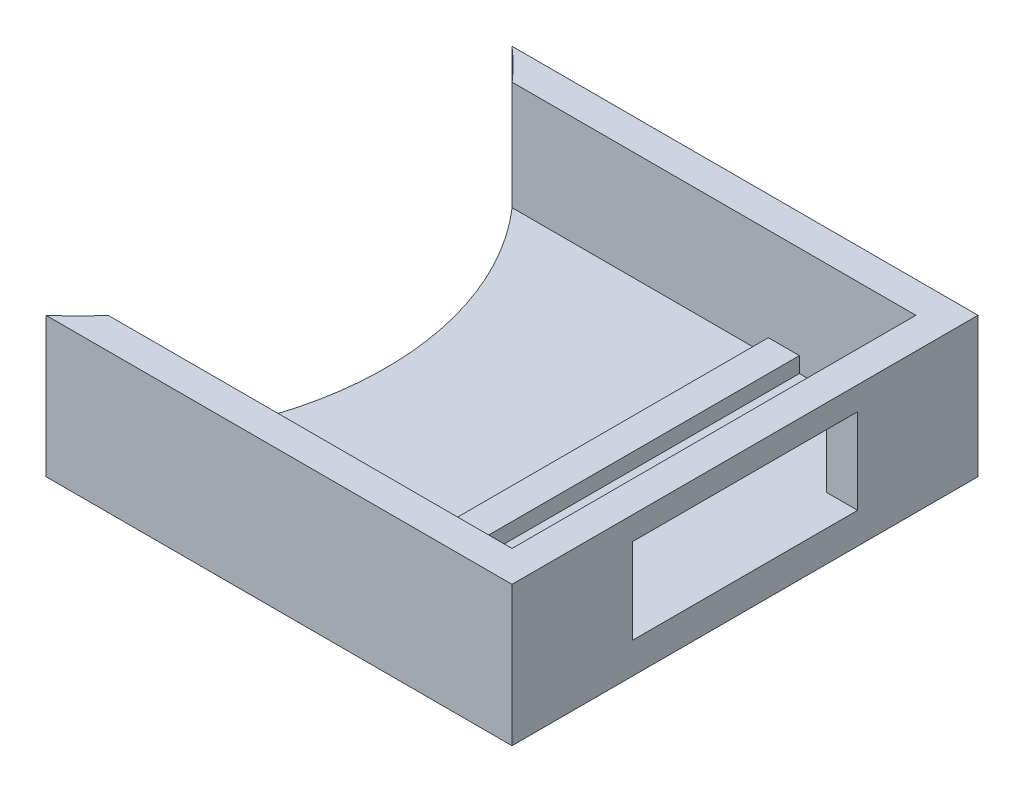
ISO-10303-21;
HEADER;
FILE_DESCRIPTION(('STEP AP214'),'2;1');
FILE_NAME('part.step','',(''),(''),'','','');
FILE_SCHEMA(('AUTOMOTIVE_DESIGN { 1 0 10303 214 1 1 1 1 }'));
ENDSEC;
DATA;
#1=APPLICATION_CONTEXT('core data for automotive mechanical design processes');
#2=APPLICATION_PROTOCOL_DEFINITION('international standard','automotive_design',2000,#1);
#3=PRODUCT_CONTEXT('',#1,'mechanical');
#4=PRODUCT('Part','Part','',(#3));
#5=PRODUCT_RELATED_PRODUCT_CATEGORY('part','',(#4));
#6=PRODUCT_DEFINITION_FORMATION('','',#4);
#7=PRODUCT_DEFINITION_CONTEXT('part definition',#1,'design');
#8=PRODUCT_DEFINITION('design','',#6,#7);
#9=PRODUCT_DEFINITION_SHAPE('','',#8);
#10=(LENGTH_UNIT() NAMED_UNIT(*) SI_UNIT(.MILLI.,.METRE.));
#11=(NAMED_UNIT(*) PLANE_ANGLE_UNIT() SI_UNIT($,.RADIAN.));
#12=(NAMED_UNIT(*) SI_UNIT($,.STERADIAN.) SOLID_ANGLE_UNIT());
#13=UNCERTAINTY_MEASURE_WITH_UNIT(LENGTH_MEASURE(1.E-05),#10,'distance_accuracy_value','');
#14=(GEOMETRIC_REPRESENTATION_CONTEXT(3) GLOBAL_UNCERTAINTY_ASSIGNED_CONTEXT((#13)) GLOBAL_UNIT_ASSIGNED_CONTEXT((#10,
#11,#12)) REPRESENTATION_CONTEXT('',''));
#15=CARTESIAN_POINT('',(0.,0.,0.));
#16=DIRECTION('',(0.,0.,1.));
#17=DIRECTION('',(1.,0.,0.));
#18=AXIS2_PLACEMENT_3D('',#15,#16,#17);
#19=CARTESIAN_POINT('',(0.,2.,0.));
#20=DIRECTION('',(0.,1.,0.));
#21=DIRECTION('',(0.,0.,1.));
#22=AXIS2_PLACEMENT_3D('',#19,#20,#21);
#23=PLANE('',#22);
#24=DIRECTION('',(-1.,0.,0.));
#25=VECTOR('',#24,1.);
#26=CARTESIAN_POINT('',(0.,2.,9.05326953750821));
#27=LINE('',#26,#25);
#28=CARTESIAN_POINT('',(2.57839758301479,2.,9.05326953750821));
#29=VERTEX_POINT('',#28);
#30=CARTESIAN_POINT('',(-13.9114741920324,2.,9.05326953750822));
#31=VERTEX_POINT('',#30);
#32=EDGE_CURVE('E276',#29,#31,#27,.T.);
#33=ORIENTED_EDGE('',*,*,#32,.F.);
#34=DIRECTION('',(0.,0.,1.));
#35=VECTOR('',#34,1.);
#36=CARTESIAN_POINT('',(2.57839758301478,2.,-16.9467304624918));
#37=LINE('',#36,#35);
#38=CARTESIAN_POINT('',(2.57839758301478,2.,-16.9467304624918));
#39=VERTEX_POINT('',#38);
#40=EDGE_CURVE('E174',#39,#29,#37,.T.);
#41=ORIENTED_EDGE('',*,*,#40,.F.);
#42=DIRECTION('',(1.,0.,0.));
#43=VECTOR('',#42,1.);
#44=CARTESIAN_POINT('',(0.,2.,-16.9467304624918));
#45=LINE('',#44,#43);
#46=CARTESIAN_POINT('',(-13.9114741920324,2.,-16.9467304624918));
#47=VERTEX_POINT('',#46);
#48=EDGE_CURVE('E249',#47,#39,#45,.T.);
#49=ORIENTED_EDGE('',*,*,#48,.F.);
#50=CARTESIAN_POINT('',(-28.845997954108,2.,-3.94673046249178));
#51=DIRECTION('',(0.,1.,0.));
#52=DIRECTION('',(0.,0.,1.));
#53=AXIS2_PLACEMENT_3D('',#50,#51,#52);
#54=CIRCLE('',#53,19.8);
#55=EDGE_CURVE('E300',#31,#47,#54,.T.);
#56=ORIENTED_EDGE('',*,*,#55,.F.);
#57=EDGE_LOOP('',(#33,#41,#49,#56));
#58=FACE_BOUND('',#57,.T.);
#59=ADVANCED_FACE('F45',(#58),#23,.T.);
#60=CARTESIAN_POINT('',(4.57839758301478,2.,-16.9467304624918));
#61=VERTEX_POINT('',#60);
#62=CARTESIAN_POINT('',(12.0783975830148,2.,-16.9467304624918));
#63=VERTEX_POINT('',#62);
#64=EDGE_CURVE('E280',#61,#63,#45,.T.);
#65=ORIENTED_EDGE('',*,*,#64,.F.);
#66=DIRECTION('',(0.,0.,-1.));
#67=VECTOR('',#66,1.);
#68=CARTESIAN_POINT('',(4.57839758301478,2.,-16.9467304624918));
#69=LINE('',#68,#67);
#70=CARTESIAN_POINT('',(4.57839758301479,2.,9.05326953750821));
#71=VERTEX_POINT('',#70);
#72=EDGE_CURVE('E168',#71,#61,#69,.T.);
#73=ORIENTED_EDGE('',*,*,#72,.F.);
#74=CARTESIAN_POINT('',(12.0783975830148,2.,9.05326953750821));
#75=VERTEX_POINT('',#74);
#76=EDGE_CURVE('E277',#75,#71,#27,.T.);
#77=ORIENTED_EDGE('',*,*,#76,.F.);
#78=DIRECTION('',(0.,0.,1.));
#79=VECTOR('',#78,1.);
#80=CARTESIAN_POINT('',(12.0783975830148,2.,0.));
#81=LINE('',#80,#79);
#82=CARTESIAN_POINT('',(12.0783975830148,2.,3.30326953750822));
#83=VERTEX_POINT('',#82);
#84=EDGE_CURVE('E234',#83,#75,#81,.T.);
#85=ORIENTED_EDGE('',*,*,#84,.F.);
#86=DIRECTION('',(-1.,0.,0.));
#87=VECTOR('',#86,1.);
#88=CARTESIAN_POINT('',(14.0783975830148,2.,3.30326953750822));
#89=LINE('',#88,#87);
#90=CARTESIAN_POINT('',(14.0783975830148,2.,3.30326953750822));
#91=VERTEX_POINT('',#90);
#92=EDGE_CURVE('E238',#91,#83,#89,.T.);
#93=ORIENTED_EDGE('',*,*,#92,.F.);
#94=DIRECTION('',(0.,0.,1.));
#95=VECTOR('',#94,1.);
#96=CARTESIAN_POINT('',(14.0783975830148,2.,-11.1967304624918));
#97=LINE('',#96,#95);
#98=CARTESIAN_POINT('',(14.0783975830148,2.,-11.1967304624918));
#99=VERTEX_POINT('',#98);
#100=EDGE_CURVE('E210',#99,#91,#97,.T.);
#101=ORIENTED_EDGE('',*,*,#100,.F.);
#102=DIRECTION('',(-1.,0.,0.));
#103=VECTOR('',#102,1.);
#104=CARTESIAN_POINT('',(14.0783975830148,2.,-11.1967304624918));
#105=LINE('',#104,#103);
#106=CARTESIAN_POINT('',(12.0783975830148,2.,-11.1967304624918));
#107=VERTEX_POINT('',#106);
#108=EDGE_CURVE('E221',#99,#107,#105,.T.);
#109=ORIENTED_EDGE('',*,*,#108,.T.);
#110=EDGE_CURVE('E273',#63,#107,#81,.T.);
#111=ORIENTED_EDGE('',*,*,#110,.F.);
#112=EDGE_LOOP('',(#65,#73,#77,#85,#93,#101,#109,#111));
#113=FACE_BOUND('',#112,.T.);
#114=ADVANCED_FACE('F406',(#113),#23,.T.);
#115=CARTESIAN_POINT('',(0.,9.,9.05326953750821));
#116=DIRECTION('',(0.,0.,1.));
#117=DIRECTION('',(1.,0.,0.));
#118=AXIS2_PLACEMENT_3D('',#115,#116,#117);
#119=PLANE('',#118);
#120=DIRECTION('',(0.,-1.,0.));
#121=VECTOR('',#120,1.);
#122=CARTESIAN_POINT('',(2.57839758301479,3.,9.05326953750821));
#123=LINE('',#122,#121);
#124=CARTESIAN_POINT('',(2.57839758301479,3.,9.05326953750821));
#125=VERTEX_POINT('',#124);
#126=EDGE_CURVE('E171',#125,#29,#123,.T.);
#127=ORIENTED_EDGE('',*,*,#126,.T.);
#128=ORIENTED_EDGE('',*,*,#32,.T.);
#129=DIRECTION('',(0.,-1.,0.));
#130=VECTOR('',#129,1.);
#131=CARTESIAN_POINT('',(-13.9114741920324,9.,9.05326953750822));
#132=LINE('',#131,#130);
#133=CARTESIAN_POINT('',(-13.9114741920324,9.,9.05326953750822));
#134=VERTEX_POINT('',#133);
#135=EDGE_CURVE('E291',#134,#31,#132,.T.);
#136=ORIENTED_EDGE('',*,*,#135,.F.);
#137=DIRECTION('',(-1.,0.,0.));
#138=VECTOR('',#137,1.);
#139=CARTESIAN_POINT('',(0.,9.,9.05326953750821));
#140=LINE('',#139,#138);
#141=CARTESIAN_POINT('',(12.0783975830148,9.,9.05326953750821));
#142=VERTEX_POINT('',#141);
#143=EDGE_CURVE('E248',#142,#134,#140,.T.);
#144=ORIENTED_EDGE('',*,*,#143,.F.);
#145=DIRECTION('',(0.,-1.,0.));
#146=VECTOR('',#145,1.);
#147=CARTESIAN_POINT('',(12.0783975830148,9.,9.05326953750821));
#148=LINE('',#147,#146);
#149=EDGE_CURVE('E295',#142,#75,#148,.T.);
#150=ORIENTED_EDGE('',*,*,#149,.T.);
#151=ORIENTED_EDGE('',*,*,#76,.T.);
#152=DIRECTION('',(0.,-1.,0.));
#153=VECTOR('',#152,1.);
#154=CARTESIAN_POINT('',(4.57839758301479,3.,9.05326953750821));
#155=LINE('',#154,#153);
#156=CARTESIAN_POINT('',(4.57839758301479,3.,9.05326953750821));
#157=VERTEX_POINT('',#156);
#158=EDGE_CURVE('E179',#157,#71,#155,.T.);
#159=ORIENTED_EDGE('',*,*,#158,.F.);
#160=DIRECTION('',(1.,0.,0.));
#161=VECTOR('',#160,1.);
#162=CARTESIAN_POINT('',(2.57839758301479,3.,9.05326953750821));
#163=LINE('',#162,#161);
#164=EDGE_CURVE('E162',#125,#157,#163,.T.);
#165=ORIENTED_EDGE('',*,*,#164,.F.);
#166=EDGE_LOOP('',(#127,#128,#136,#144,#150,#151,#159,#165));
#167=FACE_BOUND('',#166,.T.);
#168=ADVANCED_FACE('F182',(#167),#119,.F.);
#169=CARTESIAN_POINT('',(0.,9.,-16.9467304624918));
#170=DIRECTION('',(0.,0.,-1.));
#171=DIRECTION('',(-1.,0.,0.));
#172=AXIS2_PLACEMENT_3D('',#169,#170,#171);
#173=PLANE('',#172);
#174=DIRECTION('',(0.,-1.,0.));
#175=VECTOR('',#174,1.);
#176=CARTESIAN_POINT('',(2.57839758301478,3.,-16.9467304624918));
#177=LINE('',#176,#175);
#178=CARTESIAN_POINT('',(2.57839758301478,3.,-16.9467304624918));
#179=VERTEX_POINT('',#178);
#180=EDGE_CURVE('E195',#179,#39,#177,.T.);
#181=ORIENTED_EDGE('',*,*,#180,.F.);
#182=DIRECTION('',(-1.,0.,0.));
#183=VECTOR('',#182,1.);
#184=CARTESIAN_POINT('',(2.57839758301478,3.,-16.9467304624918));
#185=LINE('',#184,#183);
#186=CARTESIAN_POINT('',(4.57839758301479,3.,-16.9467304624918));
#187=VERTEX_POINT('',#186);
#188=EDGE_CURVE('E164',#187,#179,#185,.T.);
#189=ORIENTED_EDGE('',*,*,#188,.F.);
#190=DIRECTION('',(0.,-1.,0.));
#191=VECTOR('',#190,1.);
#192=CARTESIAN_POINT('',(4.57839758301478,3.,-16.9467304624918));
#193=LINE('',#192,#191);
#194=EDGE_CURVE('E61',#187,#61,#193,.T.);
#195=ORIENTED_EDGE('',*,*,#194,.T.);
#196=ORIENTED_EDGE('',*,*,#64,.T.);
#197=DIRECTION('',(0.,-1.,0.));
#198=VECTOR('',#197,1.);
#199=CARTESIAN_POINT('',(12.0783975830148,9.,-16.9467304624918));
#200=LINE('',#199,#198);
#201=CARTESIAN_POINT('',(12.0783975830148,9.,-16.9467304624918));
#202=VERTEX_POINT('',#201);
#203=EDGE_CURVE('E272',#202,#63,#200,.T.);
#204=ORIENTED_EDGE('',*,*,#203,.F.);
#205=DIRECTION('',(1.,0.,0.));
#206=VECTOR('',#205,1.);
#207=CARTESIAN_POINT('',(0.,9.,-16.9467304624918));
#208=LINE('',#207,#206);
#209=CARTESIAN_POINT('',(-13.9114741920324,9.,-16.9467304624918));
#210=VERTEX_POINT('',#209);
#211=EDGE_CURVE('E269',#210,#202,#208,.T.);
#212=ORIENTED_EDGE('',*,*,#211,.F.);
#213=DIRECTION('',(0.,-1.,0.));
#214=VECTOR('',#213,1.);
#215=CARTESIAN_POINT('',(-13.9114741920324,9.,-16.9467304624918));
#216=LINE('',#215,#214);
#217=EDGE_CURVE('E287',#210,#47,#216,.T.);
#218=ORIENTED_EDGE('',*,*,#217,.T.);
#219=ORIENTED_EDGE('',*,*,#48,.T.);
#220=EDGE_LOOP('',(#181,#189,#195,#196,#204,#212,#218,#219));
#221=FACE_BOUND('',#220,.T.);
#222=ADVANCED_FACE('F402',(#221),#173,.F.);
#223=CARTESIAN_POINT('',(-28.845997954108,2.,-3.94673046249178));
#224=DIRECTION('',(0.,-1.,0.));
#225=DIRECTION('',(0.,0.,-1.));
#226=AXIS2_PLACEMENT_3D('',#223,#224,#225);
#227=CYLINDRICAL_SURFACE('',#226,19.8);
#228=CARTESIAN_POINT('',(-28.845997954108,0.,-3.94673046249178));
#229=DIRECTION('',(0.,1.,0.));
#230=DIRECTION('',(0.,0.,1.));
#231=AXIS2_PLACEMENT_3D('',#228,#229,#230);
#232=CIRCLE('',#231,19.8);
#233=CARTESIAN_POINT('',(-15.9216024169852,0.,11.0532695375082));
#234=VERTEX_POINT('',#233);
#235=CARTESIAN_POINT('',(-15.9216024169852,0.,-18.9467304624918));
#236=VERTEX_POINT('',#235);
#237=EDGE_CURVE('E299',#234,#236,#232,.T.);
#238=ORIENTED_EDGE('',*,*,#237,.F.);
#239=DIRECTION('',(0.,-1.,0.));
#240=VECTOR('',#239,1.);
#241=CARTESIAN_POINT('',(-15.9216024169852,2.,11.0532695375082));
#242=LINE('',#241,#240);
#243=CARTESIAN_POINT('',(-15.9216024169852,9.,11.0532695375082));
#244=VERTEX_POINT('',#243);
#245=EDGE_CURVE('E11',#244,#234,#242,.T.);
#246=ORIENTED_EDGE('',*,*,#245,.F.);
#247=CARTESIAN_POINT('',(-28.845997954108,9.,-3.94673046249178));
#248=DIRECTION('',(0.,1.,0.));
#249=DIRECTION('',(0.,0.,1.));
#250=AXIS2_PLACEMENT_3D('',#247,#248,#249);
#251=CIRCLE('',#250,19.8);
#252=EDGE_CURVE('E252',#134,#244,#251,.F.);
#253=ORIENTED_EDGE('',*,*,#252,.F.);
#254=ORIENTED_EDGE('',*,*,#135,.T.);
#255=ORIENTED_EDGE('',*,*,#55,.T.);
#256=ORIENTED_EDGE('',*,*,#217,.F.);
#257=CARTESIAN_POINT('',(-15.9216024169852,9.,-18.9467304624918));
#258=VERTEX_POINT('',#257);
#259=EDGE_CURVE('E257',#258,#210,#251,.F.);
#260=ORIENTED_EDGE('',*,*,#259,.F.);
#261=DIRECTION('',(0.,-1.,0.));
#262=VECTOR('',#261,1.);
#263=CARTESIAN_POINT('',(-15.9216024169852,2.,-18.9467304624918));
#264=LINE('',#263,#262);
#265=EDGE_CURVE('E304',#258,#236,#264,.T.);
#266=ORIENTED_EDGE('',*,*,#265,.T.);
#267=EDGE_LOOP('',(#238,#246,#253,#254,#255,#256,#260,#266));
#268=FACE_BOUND('',#267,.T.);
#269=ADVANCED_FACE('F47',(#268),#227,.F.);
#270=CARTESIAN_POINT('',(0.,2.,11.0532695375082));
#271=DIRECTION('',(0.,0.,1.));
#272=DIRECTION('',(1.,0.,0.));
#273=AXIS2_PLACEMENT_3D('',#270,#271,#272);
#274=PLANE('',#273);
#275=DIRECTION('',(-1.,0.,0.));
#276=VECTOR('',#275,1.);
#277=CARTESIAN_POINT('',(0.,0.,11.0532695375082));
#278=LINE('',#277,#276);
#279=CARTESIAN_POINT('',(14.0783975830148,0.,11.0532695375082));
#280=VERTEX_POINT('',#279);
#281=EDGE_CURVE('E309',#280,#234,#278,.T.);
#282=ORIENTED_EDGE('',*,*,#281,.F.);
#283=DIRECTION('',(0.,-1.,0.));
#284=VECTOR('',#283,1.);
#285=CARTESIAN_POINT('',(14.0783975830148,2.,11.0532695375082));
#286=LINE('',#285,#284);
#287=CARTESIAN_POINT('',(14.0783975830148,9.,11.0532695375082));
#288=VERTEX_POINT('',#287);
#289=EDGE_CURVE('E54',#288,#280,#286,.T.);
#290=ORIENTED_EDGE('',*,*,#289,.F.);
#291=DIRECTION('',(1.,0.,0.));
#292=VECTOR('',#291,1.);
#293=CARTESIAN_POINT('',(0.,9.,11.0532695375082));
#294=LINE('',#293,#292);
#295=EDGE_CURVE('E256',#244,#288,#294,.T.);
#296=ORIENTED_EDGE('',*,*,#295,.F.);
#297=ORIENTED_EDGE('',*,*,#245,.T.);
#298=EDGE_LOOP('',(#282,#290,#296,#297));
#299=FACE_BOUND('',#298,.T.);
#300=ADVANCED_FACE('F334',(#299),#274,.T.);
#301=CARTESIAN_POINT('',(14.0783975830148,2.,0.));
#302=DIRECTION('',(1.,0.,0.));
#303=DIRECTION('',(0.,0.,-1.));
#304=AXIS2_PLACEMENT_3D('',#301,#302,#303);
#305=PLANE('',#304);
#306=DIRECTION('',(0.,-1.,0.));
#307=VECTOR('',#306,1.);
#308=CARTESIAN_POINT('',(14.0783975830148,2.,-11.1967304624918));
#309=LINE('',#308,#307);
#310=CARTESIAN_POINT('',(14.0783975830148,7.5,-11.1967304624918));
#311=VERTEX_POINT('',#310);
#312=EDGE_CURVE('E206',#311,#99,#309,.T.);
#313=ORIENTED_EDGE('',*,*,#312,.T.);
#314=ORIENTED_EDGE('',*,*,#100,.T.);
#315=DIRECTION('',(0.,1.,0.));
#316=VECTOR('',#315,1.);
#317=CARTESIAN_POINT('',(14.0783975830148,2.,3.30326953750822));
#318=LINE('',#317,#316);
#319=CARTESIAN_POINT('',(14.0783975830148,7.5,3.30326953750821));
#320=VERTEX_POINT('',#319);
#321=EDGE_CURVE('E69',#91,#320,#318,.T.);
#322=ORIENTED_EDGE('',*,*,#321,.T.);
#323=DIRECTION('',(0.,0.,-1.));
#324=VECTOR('',#323,1.);
#325=CARTESIAN_POINT('',(14.0783975830148,7.5,-11.1967304624918));
#326=LINE('',#325,#324);
#327=EDGE_CURVE('E217',#320,#311,#326,.T.);
#328=ORIENTED_EDGE('',*,*,#327,.T.);
#329=EDGE_LOOP('',(#313,#314,#322,#328));
#330=FACE_BOUND('',#329,.T.);
#331=DIRECTION('',(0.,0.,1.));
#332=VECTOR('',#331,1.);
#333=CARTESIAN_POINT('',(14.0783975830148,0.,0.));
#334=LINE('',#333,#332);
#335=CARTESIAN_POINT('',(14.0783975830148,0.,-18.9467304624918));
#336=VERTEX_POINT('',#335);
#337=EDGE_CURVE('E313',#336,#280,#334,.T.);
#338=ORIENTED_EDGE('',*,*,#337,.F.);
#339=DIRECTION('',(0.,-1.,0.));
#340=VECTOR('',#339,1.);
#341=CARTESIAN_POINT('',(14.0783975830148,2.,-18.9467304624918));
#342=LINE('',#341,#340);
#343=CARTESIAN_POINT('',(14.0783975830148,9.,-18.9467304624918));
#344=VERTEX_POINT('',#343);
#345=EDGE_CURVE('E322',#344,#336,#342,.T.);
#346=ORIENTED_EDGE('',*,*,#345,.F.);
#347=DIRECTION('',(0.,0.,-1.));
#348=VECTOR('',#347,1.);
#349=CARTESIAN_POINT('',(14.0783975830148,9.,0.));
#350=LINE('',#349,#348);
#351=EDGE_CURVE('E261',#288,#344,#350,.T.);
#352=ORIENTED_EDGE('',*,*,#351,.F.);
#353=ORIENTED_EDGE('',*,*,#289,.T.);
#354=EDGE_LOOP('',(#338,#346,#352,#353));
#355=FACE_BOUND('',#354,.T.);
#356=ADVANCED_FACE('F331',(#330,#355),#305,.T.);
#357=CARTESIAN_POINT('',(0.,2.,-18.9467304624918));
#358=DIRECTION('',(0.,0.,-1.));
#359=DIRECTION('',(-1.,0.,0.));
#360=AXIS2_PLACEMENT_3D('',#357,#358,#359);
#361=PLANE('',#360);
#362=DIRECTION('',(1.,0.,0.));
#363=VECTOR('',#362,1.);
#364=CARTESIAN_POINT('',(0.,0.,-18.9467304624918));
#365=LINE('',#364,#363);
#366=EDGE_CURVE('E305',#236,#336,#365,.T.);
#367=ORIENTED_EDGE('',*,*,#366,.F.);
#368=ORIENTED_EDGE('',*,*,#265,.F.);
#369=DIRECTION('',(-1.,0.,0.));
#370=VECTOR('',#369,1.);
#371=CARTESIAN_POINT('',(0.,9.,-18.9467304624918));
#372=LINE('',#371,#370);
#373=EDGE_CURVE('E265',#344,#258,#372,.T.);
#374=ORIENTED_EDGE('',*,*,#373,.F.);
#375=ORIENTED_EDGE('',*,*,#345,.T.);
#376=EDGE_LOOP('',(#367,#368,#374,#375));
#377=FACE_BOUND('',#376,.T.);
#378=ADVANCED_FACE('F340',(#377),#361,.T.);
#379=CARTESIAN_POINT('',(0.,0.,0.));
#380=DIRECTION('',(0.,1.,0.));
#381=DIRECTION('',(0.,0.,1.));
#382=AXIS2_PLACEMENT_3D('',#379,#380,#381);
#383=PLANE('',#382);
#384=ORIENTED_EDGE('',*,*,#237,.T.);
#385=ORIENTED_EDGE('',*,*,#366,.T.);
#386=ORIENTED_EDGE('',*,*,#337,.T.);
#387=ORIENTED_EDGE('',*,*,#281,.T.);
#388=EDGE_LOOP('',(#384,#385,#386,#387));
#389=FACE_BOUND('',#388,.T.);
#390=ADVANCED_FACE('F337',(#389),#383,.F.);
#391=CARTESIAN_POINT('',(12.0783975830148,9.,0.));
#392=DIRECTION('',(1.,0.,0.));
#393=DIRECTION('',(0.,0.,-1.));
#394=AXIS2_PLACEMENT_3D('',#391,#392,#393);
#395=PLANE('',#394);
#396=ORIENTED_EDGE('',*,*,#110,.T.);
#397=DIRECTION('',(0.,-1.,0.));
#398=VECTOR('',#397,1.);
#399=CARTESIAN_POINT('',(12.0783975830148,2.,-11.1967304624918));
#400=LINE('',#399,#398);
#401=CARTESIAN_POINT('',(12.0783975830148,7.5,-11.1967304624918));
#402=VERTEX_POINT('',#401);
#403=EDGE_CURVE('E178',#402,#107,#400,.T.);
#404=ORIENTED_EDGE('',*,*,#403,.F.);
#405=DIRECTION('',(0.,0.,-1.));
#406=VECTOR('',#405,1.);
#407=CARTESIAN_POINT('',(12.0783975830148,7.5,-11.1967304624918));
#408=LINE('',#407,#406);
#409=CARTESIAN_POINT('',(12.0783975830148,7.5,3.30326953750822));
#410=VERTEX_POINT('',#409);
#411=EDGE_CURVE('E211',#410,#402,#408,.T.);
#412=ORIENTED_EDGE('',*,*,#411,.F.);
#413=DIRECTION('',(0.,1.,0.));
#414=VECTOR('',#413,1.);
#415=CARTESIAN_POINT('',(12.0783975830148,2.,3.30326953750822));
#416=LINE('',#415,#414);
#417=EDGE_CURVE('E224',#83,#410,#416,.T.);
#418=ORIENTED_EDGE('',*,*,#417,.F.);
#419=ORIENTED_EDGE('',*,*,#84,.T.);
#420=ORIENTED_EDGE('',*,*,#149,.F.);
#421=DIRECTION('',(0.,0.,1.));
#422=VECTOR('',#421,1.);
#423=CARTESIAN_POINT('',(12.0783975830148,9.,0.));
#424=LINE('',#423,#422);
#425=EDGE_CURVE('E244',#202,#142,#424,.T.);
#426=ORIENTED_EDGE('',*,*,#425,.F.);
#427=ORIENTED_EDGE('',*,*,#203,.T.);
#428=EDGE_LOOP('',(#396,#404,#412,#418,#419,#420,#426,#427));
#429=FACE_BOUND('',#428,.T.);
#430=ADVANCED_FACE('F410',(#429),#395,.F.);
#431=CARTESIAN_POINT('',(0.,9.,0.));
#432=DIRECTION('',(0.,1.,0.));
#433=DIRECTION('',(0.,0.,1.));
#434=AXIS2_PLACEMENT_3D('',#431,#432,#433);
#435=PLANE('',#434);
#436=ORIENTED_EDGE('',*,*,#425,.T.);
#437=ORIENTED_EDGE('',*,*,#143,.T.);
#438=ORIENTED_EDGE('',*,*,#252,.T.);
#439=ORIENTED_EDGE('',*,*,#295,.T.);
#440=ORIENTED_EDGE('',*,*,#351,.T.);
#441=ORIENTED_EDGE('',*,*,#373,.T.);
#442=ORIENTED_EDGE('',*,*,#259,.T.);
#443=ORIENTED_EDGE('',*,*,#211,.T.);
#444=EDGE_LOOP('',(#436,#437,#438,#439,#440,#441,#442,#443));
#445=FACE_BOUND('',#444,.T.);
#446=ADVANCED_FACE('F343',(#445),#435,.T.);
#447=CARTESIAN_POINT('',(14.0783975830148,2.,-11.1967304624918));
#448=DIRECTION('',(0.,0.,-1.));
#449=DIRECTION('',(-1.,0.,0.));
#450=AXIS2_PLACEMENT_3D('',#447,#448,#449);
#451=PLANE('',#450);
#452=ORIENTED_EDGE('',*,*,#403,.T.);
#453=ORIENTED_EDGE('',*,*,#108,.F.);
#454=ORIENTED_EDGE('',*,*,#312,.F.);
#455=DIRECTION('',(-1.,0.,0.));
#456=VECTOR('',#455,1.);
#457=CARTESIAN_POINT('',(14.0783975830148,7.5,-11.1967304624918));
#458=LINE('',#457,#456);
#459=EDGE_CURVE('E231',#311,#402,#458,.T.);
#460=ORIENTED_EDGE('',*,*,#459,.T.);
#461=EDGE_LOOP('',(#452,#453,#454,#460));
#462=FACE_BOUND('',#461,.T.);
#463=ADVANCED_FACE('F454',(#462),#451,.F.);
#464=CARTESIAN_POINT('',(14.0783975830148,7.5,-11.1967304624918));
#465=DIRECTION('',(0.,1.,0.));
#466=DIRECTION('',(0.,0.,1.));
#467=AXIS2_PLACEMENT_3D('',#464,#465,#466);
#468=PLANE('',#467);
#469=ORIENTED_EDGE('',*,*,#411,.T.);
#470=ORIENTED_EDGE('',*,*,#459,.F.);
#471=ORIENTED_EDGE('',*,*,#327,.F.);
#472=DIRECTION('',(-1.,0.,0.));
#473=VECTOR('',#472,1.);
#474=CARTESIAN_POINT('',(14.0783975830148,7.5,3.30326953750821));
#475=LINE('',#474,#473);
#476=EDGE_CURVE('E235',#320,#410,#475,.T.);
#477=ORIENTED_EDGE('',*,*,#476,.T.);
#478=EDGE_LOOP('',(#469,#470,#471,#477));
#479=FACE_BOUND('',#478,.T.);
#480=ADVANCED_FACE('F457',(#479),#468,.F.);
#481=CARTESIAN_POINT('',(14.0783975830148,2.,3.30326953750822));
#482=DIRECTION('',(0.,0.,1.));
#483=DIRECTION('',(0.,-1.,0.));
#484=AXIS2_PLACEMENT_3D('',#481,#482,#483);
#485=PLANE('',#484);
#486=ORIENTED_EDGE('',*,*,#417,.T.);
#487=ORIENTED_EDGE('',*,*,#476,.F.);
#488=ORIENTED_EDGE('',*,*,#321,.F.);
#489=ORIENTED_EDGE('',*,*,#92,.T.);
#490=EDGE_LOOP('',(#486,#487,#488,#489));
#491=FACE_BOUND('',#490,.T.);
#492=ADVANCED_FACE('F424',(#491),#485,.F.);
#493=CARTESIAN_POINT('',(2.57839758301478,3.,-16.9467304624918));
#494=DIRECTION('',(1.,0.,0.));
#495=DIRECTION('',(0.,0.,-1.));
#496=AXIS2_PLACEMENT_3D('',#493,#494,#495);
#497=PLANE('',#496);
#498=ORIENTED_EDGE('',*,*,#40,.T.);
#499=ORIENTED_EDGE('',*,*,#126,.F.);
#500=DIRECTION('',(0.,0.,1.));
#501=VECTOR('',#500,1.);
#502=CARTESIAN_POINT('',(2.57839758301478,3.,-16.9467304624918));
#503=LINE('',#502,#501);
#504=EDGE_CURVE('E158',#179,#125,#503,.T.);
#505=ORIENTED_EDGE('',*,*,#504,.F.);
#506=ORIENTED_EDGE('',*,*,#180,.T.);
#507=EDGE_LOOP('',(#498,#499,#505,#506));
#508=FACE_BOUND('',#507,.T.);
#509=ADVANCED_FACE('F172',(#508),#497,.F.);
#510=CARTESIAN_POINT('',(4.57839758301478,3.,-16.9467304624918));
#511=DIRECTION('',(-1.,0.,0.));
#512=DIRECTION('',(0.,0.,1.));
#513=AXIS2_PLACEMENT_3D('',#510,#511,#512);
#514=PLANE('',#513);
#515=ORIENTED_EDGE('',*,*,#72,.T.);
#516=ORIENTED_EDGE('',*,*,#194,.F.);
#517=DIRECTION('',(0.,0.,-1.));
#518=VECTOR('',#517,1.);
#519=CARTESIAN_POINT('',(4.57839758301478,3.,-16.9467304624918));
#520=LINE('',#519,#518);
#521=EDGE_CURVE('E185',#157,#187,#520,.T.);
#522=ORIENTED_EDGE('',*,*,#521,.F.);
#523=ORIENTED_EDGE('',*,*,#158,.T.);
#524=EDGE_LOOP('',(#515,#516,#522,#523));
#525=FACE_BOUND('',#524,.T.);
#526=ADVANCED_FACE('F416',(#525),#514,.F.);
#527=CARTESIAN_POINT('',(0.,3.,0.));
#528=DIRECTION('',(0.,1.,0.));
#529=DIRECTION('',(0.,0.,1.));
#530=AXIS2_PLACEMENT_3D('',#527,#528,#529);
#531=PLANE('',#530);
#532=ORIENTED_EDGE('',*,*,#504,.T.);
#533=ORIENTED_EDGE('',*,*,#164,.T.);
#534=ORIENTED_EDGE('',*,*,#521,.T.);
#535=ORIENTED_EDGE('',*,*,#188,.T.);
#536=EDGE_LOOP('',(#532,#533,#534,#535));
#537=FACE_BOUND('',#536,.T.);
#538=ADVANCED_FACE('F160',(#537),#531,.T.);
#539=CLOSED_SHELL('',(#59,#114,#168,#222,#269,#300,#356,#378,#390,#430,#446,#463,#480,#492,#509,
#526,#538));
#540=MANIFOLD_SOLID_BREP('B2',#539);
#541=ADVANCED_BREP_SHAPE_REPRESENTATION('',(#18,#540),#14);
#542=SHAPE_DEFINITION_REPRESENTATION(#9,#541);
ENDSEC;
END-ISO-10303-21;
